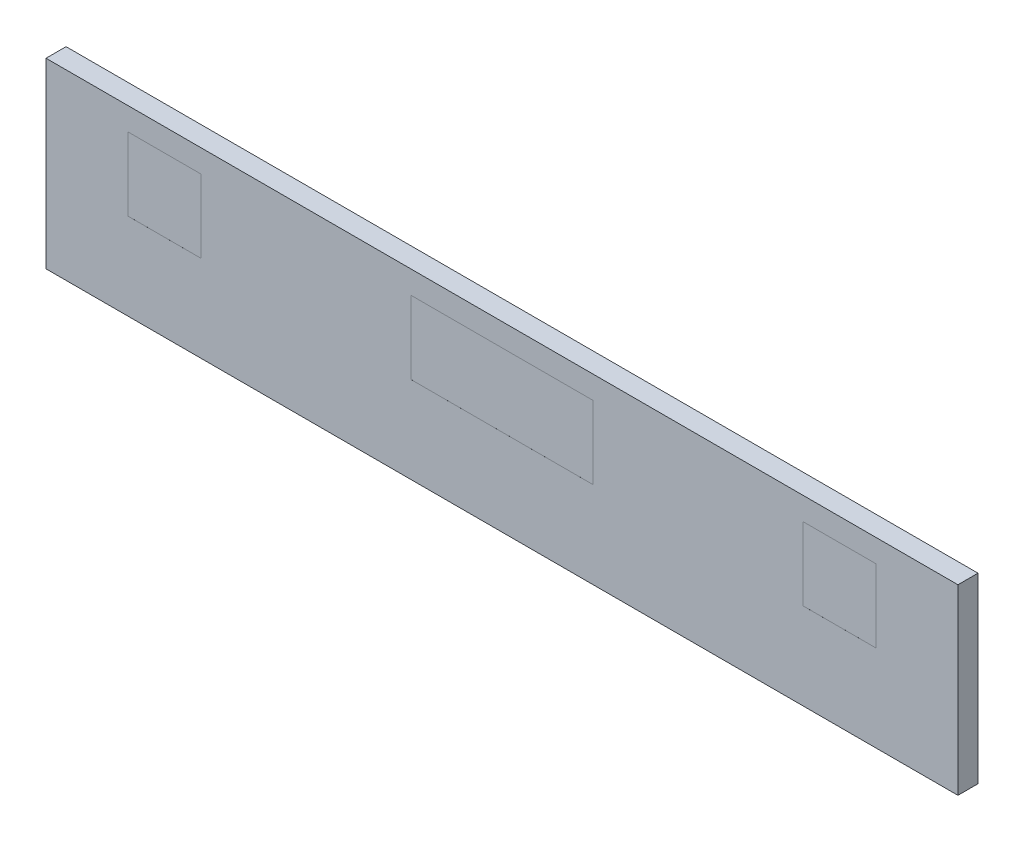
ISO-10303-21;
HEADER;
FILE_DESCRIPTION(('STEP AP214'),'2;1');
FILE_NAME('part.step','',(''),(''),'','','');
FILE_SCHEMA(('AUTOMOTIVE_DESIGN { 1 0 10303 214 1 1 1 1 }'));
ENDSEC;
DATA;
#1=APPLICATION_CONTEXT('core data for automotive mechanical design processes');
#2=APPLICATION_PROTOCOL_DEFINITION('international standard','automotive_design',2000,#1);
#3=PRODUCT_CONTEXT('',#1,'mechanical');
#4=PRODUCT('Part','Part','',(#3));
#5=PRODUCT_RELATED_PRODUCT_CATEGORY('part','',(#4));
#6=PRODUCT_DEFINITION_FORMATION('','',#4);
#7=PRODUCT_DEFINITION_CONTEXT('part definition',#1,'design');
#8=PRODUCT_DEFINITION('design','',#6,#7);
#9=PRODUCT_DEFINITION_SHAPE('','',#8);
#10=(LENGTH_UNIT() NAMED_UNIT(*) SI_UNIT(.MILLI.,.METRE.));
#11=(NAMED_UNIT(*) PLANE_ANGLE_UNIT() SI_UNIT($,.RADIAN.));
#12=(NAMED_UNIT(*) SI_UNIT($,.STERADIAN.) SOLID_ANGLE_UNIT());
#13=UNCERTAINTY_MEASURE_WITH_UNIT(LENGTH_MEASURE(1.E-05),#10,'distance_accuracy_value','');
#14=(GEOMETRIC_REPRESENTATION_CONTEXT(3) GLOBAL_UNCERTAINTY_ASSIGNED_CONTEXT((#13)) GLOBAL_UNIT_ASSIGNED_CONTEXT((#10,
#11,#12)) REPRESENTATION_CONTEXT('',''));
#15=CARTESIAN_POINT('',(0.,0.,0.));
#16=DIRECTION('',(0.,0.,1.));
#17=DIRECTION('',(1.,0.,0.));
#18=AXIS2_PLACEMENT_3D('',#15,#16,#17);
#19=CARTESIAN_POINT('',(370.,135.,21.99));
#20=DIRECTION('',(0.,0.,-1.));
#21=DIRECTION('',(-1.,0.,0.));
#22=AXIS2_PLACEMENT_3D('',#19,#20,#21);
#23=PLANE('',#22);
#24=DIRECTION('',(0.,1.,0.));
#25=VECTOR('',#24,1.);
#26=CARTESIAN_POINT('',(410.,175.,21.99));
#27=LINE('',#26,#25);
#28=CARTESIAN_POINT('',(410.,95.,21.99));
#29=VERTEX_POINT('',#28);
#30=CARTESIAN_POINT('',(410.,175.,21.99));
#31=VERTEX_POINT('',#30);
#32=EDGE_CURVE('E20',#29,#31,#27,.T.);
#33=ORIENTED_EDGE('',*,*,#32,.T.);
#34=DIRECTION('',(-1.,0.,0.));
#35=VECTOR('',#34,1.);
#36=CARTESIAN_POINT('',(330.,175.,21.99));
#37=LINE('',#36,#35);
#38=CARTESIAN_POINT('',(330.,175.,21.99));
#39=VERTEX_POINT('',#38);
#40=EDGE_CURVE('E151',#31,#39,#37,.T.);
#41=ORIENTED_EDGE('',*,*,#40,.T.);
#42=DIRECTION('',(0.,1.,0.));
#43=VECTOR('',#42,1.);
#44=CARTESIAN_POINT('',(330.,95.0000000000001,21.99));
#45=LINE('',#44,#43);
#46=CARTESIAN_POINT('',(330.,95.,21.99));
#47=VERTEX_POINT('',#46);
#48=EDGE_CURVE('E143',#39,#47,#45,.F.);
#49=ORIENTED_EDGE('',*,*,#48,.T.);
#50=DIRECTION('',(1.,0.,0.));
#51=VECTOR('',#50,1.);
#52=CARTESIAN_POINT('',(410.,95.,21.99));
#53=LINE('',#52,#51);
#54=EDGE_CURVE('E127',#47,#29,#53,.T.);
#55=ORIENTED_EDGE('',*,*,#54,.T.);
#56=EDGE_LOOP('',(#33,#41,#49,#55));
#57=FACE_BOUND('',#56,.T.);
#58=ADVANCED_FACE('F17',(#57),#23,.F.);
#59=CARTESIAN_POINT('',(0.,135.,21.99));
#60=DIRECTION('',(0.,0.,-1.));
#61=DIRECTION('',(-1.,0.,0.));
#62=AXIS2_PLACEMENT_3D('',#59,#60,#61);
#63=PLANE('',#62);
#64=DIRECTION('',(0.,1.,0.));
#65=VECTOR('',#64,1.);
#66=CARTESIAN_POINT('',(100.,175.,21.99));
#67=LINE('',#66,#65);
#68=CARTESIAN_POINT('',(100.,95.,21.99));
#69=VERTEX_POINT('',#68);
#70=CARTESIAN_POINT('',(100.,175.,21.99));
#71=VERTEX_POINT('',#70);
#72=EDGE_CURVE('E156',#69,#71,#67,.T.);
#73=ORIENTED_EDGE('',*,*,#72,.T.);
#74=DIRECTION('',(1.,0.,0.));
#75=VECTOR('',#74,1.);
#76=CARTESIAN_POINT('',(-100.,175.,21.99));
#77=LINE('',#76,#75);
#78=CARTESIAN_POINT('',(-100.,175.,21.99));
#79=VERTEX_POINT('',#78);
#80=EDGE_CURVE('E173',#71,#79,#77,.F.);
#81=ORIENTED_EDGE('',*,*,#80,.T.);
#82=DIRECTION('',(0.,1.,0.));
#83=VECTOR('',#82,1.);
#84=CARTESIAN_POINT('',(-100.,95.,21.99));
#85=LINE('',#84,#83);
#86=CARTESIAN_POINT('',(-100.,95.,21.99));
#87=VERTEX_POINT('',#86);
#88=EDGE_CURVE('E164',#79,#87,#85,.F.);
#89=ORIENTED_EDGE('',*,*,#88,.T.);
#90=DIRECTION('',(1.,0.,0.));
#91=VECTOR('',#90,1.);
#92=CARTESIAN_POINT('',(100.,95.,21.99));
#93=LINE('',#92,#91);
#94=EDGE_CURVE('E158',#87,#69,#93,.T.);
#95=ORIENTED_EDGE('',*,*,#94,.T.);
#96=EDGE_LOOP('',(#73,#81,#89,#95));
#97=FACE_BOUND('',#96,.T.);
#98=ADVANCED_FACE('F333',(#97),#63,.F.);
#99=CARTESIAN_POINT('',(-370.,135.,21.99));
#100=DIRECTION('',(0.,0.,-1.));
#101=DIRECTION('',(-1.,0.,0.));
#102=AXIS2_PLACEMENT_3D('',#99,#100,#101);
#103=PLANE('',#102);
#104=DIRECTION('',(0.,1.,0.));
#105=VECTOR('',#104,1.);
#106=CARTESIAN_POINT('',(-330.,175.,21.99));
#107=LINE('',#106,#105);
#108=CARTESIAN_POINT('',(-330.,95.,21.99));
#109=VERTEX_POINT('',#108);
#110=CARTESIAN_POINT('',(-330.,175.,21.99));
#111=VERTEX_POINT('',#110);
#112=EDGE_CURVE('E179',#109,#111,#107,.T.);
#113=ORIENTED_EDGE('',*,*,#112,.T.);
#114=DIRECTION('',(1.,0.,0.));
#115=VECTOR('',#114,1.);
#116=CARTESIAN_POINT('',(-410.,175.,21.99));
#117=LINE('',#116,#115);
#118=CARTESIAN_POINT('',(-410.,175.,21.99));
#119=VERTEX_POINT('',#118);
#120=EDGE_CURVE('E196',#111,#119,#117,.F.);
#121=ORIENTED_EDGE('',*,*,#120,.T.);
#122=DIRECTION('',(0.,1.,0.));
#123=VECTOR('',#122,1.);
#124=CARTESIAN_POINT('',(-410.,95.,21.99));
#125=LINE('',#124,#123);
#126=CARTESIAN_POINT('',(-410.,95.,21.99));
#127=VERTEX_POINT('',#126);
#128=EDGE_CURVE('E187',#119,#127,#125,.F.);
#129=ORIENTED_EDGE('',*,*,#128,.T.);
#130=DIRECTION('',(1.,0.,0.));
#131=VECTOR('',#130,1.);
#132=CARTESIAN_POINT('',(-330.,95.,21.99));
#133=LINE('',#132,#131);
#134=EDGE_CURVE('E181',#127,#109,#133,.T.);
#135=ORIENTED_EDGE('',*,*,#134,.T.);
#136=EDGE_LOOP('',(#113,#121,#129,#135));
#137=FACE_BOUND('',#136,.T.);
#138=ADVANCED_FACE('F331',(#137),#103,.F.);
#139=CARTESIAN_POINT('',(410.,175.,22.));
#140=DIRECTION('',(1.,0.,0.));
#141=DIRECTION('',(0.,0.,-1.));
#142=AXIS2_PLACEMENT_3D('',#139,#140,#141);
#143=PLANE('',#142);
#144=DIRECTION('',(0.,0.,1.));
#145=VECTOR('',#144,1.);
#146=CARTESIAN_POINT('',(410.,175.,22.));
#147=LINE('',#146,#145);
#148=CARTESIAN_POINT('',(410.,175.,22.));
#149=VERTEX_POINT('',#148);
#150=EDGE_CURVE('E137',#149,#31,#147,.F.);
#151=ORIENTED_EDGE('',*,*,#150,.T.);
#152=ORIENTED_EDGE('',*,*,#32,.F.);
#153=DIRECTION('',(0.,0.,1.));
#154=VECTOR('',#153,1.);
#155=CARTESIAN_POINT('',(410.,95.,22.));
#156=LINE('',#155,#154);
#157=CARTESIAN_POINT('',(410.,95.,22.));
#158=VERTEX_POINT('',#157);
#159=EDGE_CURVE('E135',#29,#158,#156,.T.);
#160=ORIENTED_EDGE('',*,*,#159,.T.);
#161=DIRECTION('',(0.,1.,0.));
#162=VECTOR('',#161,1.);
#163=CARTESIAN_POINT('',(410.,100.,22.));
#164=LINE('',#163,#162);
#165=EDGE_CURVE('E202',#149,#158,#164,.F.);
#166=ORIENTED_EDGE('',*,*,#165,.F.);
#167=EDGE_LOOP('',(#151,#152,#160,#166));
#168=FACE_BOUND('',#167,.T.);
#169=ADVANCED_FACE('F133',(#168),#143,.F.);
#170=CARTESIAN_POINT('',(410.,95.,22.));
#171=DIRECTION('',(0.,-1.,0.));
#172=DIRECTION('',(1.,0.,0.));
#173=AXIS2_PLACEMENT_3D('',#170,#171,#172);
#174=PLANE('',#173);
#175=ORIENTED_EDGE('',*,*,#159,.F.);
#176=ORIENTED_EDGE('',*,*,#54,.F.);
#177=DIRECTION('',(0.,0.,1.));
#178=VECTOR('',#177,1.);
#179=CARTESIAN_POINT('',(330.,95.0000000000001,22.));
#180=LINE('',#179,#178);
#181=CARTESIAN_POINT('',(330.,95.0000000000001,22.));
#182=VERTEX_POINT('',#181);
#183=EDGE_CURVE('E148',#47,#182,#180,.T.);
#184=ORIENTED_EDGE('',*,*,#183,.T.);
#185=DIRECTION('',(1.,0.,0.));
#186=VECTOR('',#185,1.);
#187=CARTESIAN_POINT('',(0.,95.,22.));
#188=LINE('',#187,#186);
#189=EDGE_CURVE('E142',#158,#182,#188,.F.);
#190=ORIENTED_EDGE('',*,*,#189,.F.);
#191=EDGE_LOOP('',(#175,#176,#184,#190));
#192=FACE_BOUND('',#191,.T.);
#193=ADVANCED_FACE('F141',(#192),#174,.F.);
#194=CARTESIAN_POINT('',(330.,95.0000000000001,22.));
#195=DIRECTION('',(-1.,0.,0.));
#196=DIRECTION('',(0.,0.,1.));
#197=AXIS2_PLACEMENT_3D('',#194,#195,#196);
#198=PLANE('',#197);
#199=ORIENTED_EDGE('',*,*,#183,.F.);
#200=ORIENTED_EDGE('',*,*,#48,.F.);
#201=DIRECTION('',(0.,0.,1.));
#202=VECTOR('',#201,1.);
#203=CARTESIAN_POINT('',(330.,175.,22.));
#204=LINE('',#203,#202);
#205=CARTESIAN_POINT('',(330.,175.,22.));
#206=VERTEX_POINT('',#205);
#207=EDGE_CURVE('E153',#39,#206,#204,.T.);
#208=ORIENTED_EDGE('',*,*,#207,.T.);
#209=DIRECTION('',(0.,1.,0.));
#210=VECTOR('',#209,1.);
#211=CARTESIAN_POINT('',(330.,100.,22.));
#212=LINE('',#211,#210);
#213=EDGE_CURVE('E205',#182,#206,#212,.T.);
#214=ORIENTED_EDGE('',*,*,#213,.F.);
#215=EDGE_LOOP('',(#199,#200,#208,#214));
#216=FACE_BOUND('',#215,.T.);
#217=ADVANCED_FACE('F322',(#216),#198,.F.);
#218=CARTESIAN_POINT('',(330.,175.,22.));
#219=DIRECTION('',(0.,1.,0.));
#220=DIRECTION('',(-1.,0.,0.));
#221=AXIS2_PLACEMENT_3D('',#218,#219,#220);
#222=PLANE('',#221);
#223=ORIENTED_EDGE('',*,*,#207,.F.);
#224=ORIENTED_EDGE('',*,*,#40,.F.);
#225=ORIENTED_EDGE('',*,*,#150,.F.);
#226=DIRECTION('',(1.,0.,0.));
#227=VECTOR('',#226,1.);
#228=CARTESIAN_POINT('',(0.,175.,22.));
#229=LINE('',#228,#227);
#230=EDGE_CURVE('E207',#206,#149,#229,.T.);
#231=ORIENTED_EDGE('',*,*,#230,.F.);
#232=EDGE_LOOP('',(#223,#224,#225,#231));
#233=FACE_BOUND('',#232,.T.);
#234=ADVANCED_FACE('F318',(#233),#222,.F.);
#235=CARTESIAN_POINT('',(100.,175.,22.));
#236=DIRECTION('',(1.,0.,0.));
#237=DIRECTION('',(0.,0.,-1.));
#238=AXIS2_PLACEMENT_3D('',#235,#236,#237);
#239=PLANE('',#238);
#240=DIRECTION('',(0.,0.,1.));
#241=VECTOR('',#240,1.);
#242=CARTESIAN_POINT('',(100.,175.,22.));
#243=LINE('',#242,#241);
#244=CARTESIAN_POINT('',(100.,175.,22.));
#245=VERTEX_POINT('',#244);
#246=EDGE_CURVE('E170',#245,#71,#243,.F.);
#247=ORIENTED_EDGE('',*,*,#246,.T.);
#248=ORIENTED_EDGE('',*,*,#72,.F.);
#249=DIRECTION('',(0.,0.,-1.));
#250=VECTOR('',#249,1.);
#251=CARTESIAN_POINT('',(100.,95.,22.));
#252=LINE('',#251,#250);
#253=CARTESIAN_POINT('',(100.,95.,22.));
#254=VERTEX_POINT('',#253);
#255=EDGE_CURVE('E161',#69,#254,#252,.F.);
#256=ORIENTED_EDGE('',*,*,#255,.T.);
#257=DIRECTION('',(0.,1.,0.));
#258=VECTOR('',#257,1.);
#259=CARTESIAN_POINT('',(100.,100.,22.));
#260=LINE('',#259,#258);
#261=EDGE_CURVE('E210',#245,#254,#260,.F.);
#262=ORIENTED_EDGE('',*,*,#261,.F.);
#263=EDGE_LOOP('',(#247,#248,#256,#262));
#264=FACE_BOUND('',#263,.T.);
#265=ADVANCED_FACE('F314',(#264),#239,.F.);
#266=CARTESIAN_POINT('',(100.,95.,22.));
#267=DIRECTION('',(0.,-1.,0.));
#268=DIRECTION('',(0.,0.,-1.));
#269=AXIS2_PLACEMENT_3D('',#266,#267,#268);
#270=PLANE('',#269);
#271=ORIENTED_EDGE('',*,*,#255,.F.);
#272=ORIENTED_EDGE('',*,*,#94,.F.);
#273=DIRECTION('',(0.,0.,1.));
#274=VECTOR('',#273,1.);
#275=CARTESIAN_POINT('',(-100.,95.,22.));
#276=LINE('',#275,#274);
#277=CARTESIAN_POINT('',(-100.,95.,22.));
#278=VERTEX_POINT('',#277);
#279=EDGE_CURVE('E167',#87,#278,#276,.T.);
#280=ORIENTED_EDGE('',*,*,#279,.T.);
#281=DIRECTION('',(1.,0.,0.));
#282=VECTOR('',#281,1.);
#283=CARTESIAN_POINT('',(0.,95.,22.));
#284=LINE('',#283,#282);
#285=EDGE_CURVE('E212',#254,#278,#284,.F.);
#286=ORIENTED_EDGE('',*,*,#285,.F.);
#287=EDGE_LOOP('',(#271,#272,#280,#286));
#288=FACE_BOUND('',#287,.T.);
#289=ADVANCED_FACE('F310',(#288),#270,.F.);
#290=CARTESIAN_POINT('',(-100.,95.,22.));
#291=DIRECTION('',(-1.,0.,0.));
#292=DIRECTION('',(0.,0.,1.));
#293=AXIS2_PLACEMENT_3D('',#290,#291,#292);
#294=PLANE('',#293);
#295=ORIENTED_EDGE('',*,*,#279,.F.);
#296=ORIENTED_EDGE('',*,*,#88,.F.);
#297=DIRECTION('',(0.,0.,1.));
#298=VECTOR('',#297,1.);
#299=CARTESIAN_POINT('',(-100.,175.,22.));
#300=LINE('',#299,#298);
#301=CARTESIAN_POINT('',(-100.,175.,22.));
#302=VERTEX_POINT('',#301);
#303=EDGE_CURVE('E176',#79,#302,#300,.T.);
#304=ORIENTED_EDGE('',*,*,#303,.T.);
#305=DIRECTION('',(0.,1.,0.));
#306=VECTOR('',#305,1.);
#307=CARTESIAN_POINT('',(-100.,100.,22.));
#308=LINE('',#307,#306);
#309=EDGE_CURVE('E214',#278,#302,#308,.T.);
#310=ORIENTED_EDGE('',*,*,#309,.F.);
#311=EDGE_LOOP('',(#295,#296,#304,#310));
#312=FACE_BOUND('',#311,.T.);
#313=ADVANCED_FACE('F306',(#312),#294,.F.);
#314=CARTESIAN_POINT('',(-100.,175.,22.));
#315=DIRECTION('',(0.,1.,0.));
#316=DIRECTION('',(0.,0.,1.));
#317=AXIS2_PLACEMENT_3D('',#314,#315,#316);
#318=PLANE('',#317);
#319=ORIENTED_EDGE('',*,*,#303,.F.);
#320=ORIENTED_EDGE('',*,*,#80,.F.);
#321=ORIENTED_EDGE('',*,*,#246,.F.);
#322=DIRECTION('',(1.,0.,0.));
#323=VECTOR('',#322,1.);
#324=CARTESIAN_POINT('',(0.,175.,22.));
#325=LINE('',#324,#323);
#326=EDGE_CURVE('E216',#302,#245,#325,.T.);
#327=ORIENTED_EDGE('',*,*,#326,.F.);
#328=EDGE_LOOP('',(#319,#320,#321,#327));
#329=FACE_BOUND('',#328,.T.);
#330=ADVANCED_FACE('F302',(#329),#318,.F.);
#331=CARTESIAN_POINT('',(-330.,175.,22.));
#332=DIRECTION('',(1.,0.,0.));
#333=DIRECTION('',(0.,0.,-1.));
#334=AXIS2_PLACEMENT_3D('',#331,#332,#333);
#335=PLANE('',#334);
#336=DIRECTION('',(0.,0.,1.));
#337=VECTOR('',#336,1.);
#338=CARTESIAN_POINT('',(-330.,175.,22.));
#339=LINE('',#338,#337);
#340=CARTESIAN_POINT('',(-330.,175.,22.));
#341=VERTEX_POINT('',#340);
#342=EDGE_CURVE('E193',#341,#111,#339,.F.);
#343=ORIENTED_EDGE('',*,*,#342,.T.);
#344=ORIENTED_EDGE('',*,*,#112,.F.);
#345=DIRECTION('',(0.,0.,-1.));
#346=VECTOR('',#345,1.);
#347=CARTESIAN_POINT('',(-330.,95.,22.));
#348=LINE('',#347,#346);
#349=CARTESIAN_POINT('',(-330.,95.,22.));
#350=VERTEX_POINT('',#349);
#351=EDGE_CURVE('E184',#109,#350,#348,.F.);
#352=ORIENTED_EDGE('',*,*,#351,.T.);
#353=DIRECTION('',(0.,1.,0.));
#354=VECTOR('',#353,1.);
#355=CARTESIAN_POINT('',(-330.,100.,22.));
#356=LINE('',#355,#354);
#357=EDGE_CURVE('E219',#341,#350,#356,.F.);
#358=ORIENTED_EDGE('',*,*,#357,.F.);
#359=EDGE_LOOP('',(#343,#344,#352,#358));
#360=FACE_BOUND('',#359,.T.);
#361=ADVANCED_FACE('F298',(#360),#335,.F.);
#362=CARTESIAN_POINT('',(-330.,95.,22.));
#363=DIRECTION('',(0.,-1.,0.));
#364=DIRECTION('',(0.,0.,-1.));
#365=AXIS2_PLACEMENT_3D('',#362,#363,#364);
#366=PLANE('',#365);
#367=ORIENTED_EDGE('',*,*,#351,.F.);
#368=ORIENTED_EDGE('',*,*,#134,.F.);
#369=DIRECTION('',(0.,0.,1.));
#370=VECTOR('',#369,1.);
#371=CARTESIAN_POINT('',(-410.,95.,22.));
#372=LINE('',#371,#370);
#373=CARTESIAN_POINT('',(-410.,95.,22.));
#374=VERTEX_POINT('',#373);
#375=EDGE_CURVE('E190',#127,#374,#372,.T.);
#376=ORIENTED_EDGE('',*,*,#375,.T.);
#377=DIRECTION('',(1.,0.,0.));
#378=VECTOR('',#377,1.);
#379=CARTESIAN_POINT('',(0.,95.,22.));
#380=LINE('',#379,#378);
#381=EDGE_CURVE('E221',#350,#374,#380,.F.);
#382=ORIENTED_EDGE('',*,*,#381,.F.);
#383=EDGE_LOOP('',(#367,#368,#376,#382));
#384=FACE_BOUND('',#383,.T.);
#385=ADVANCED_FACE('F294',(#384),#366,.F.);
#386=CARTESIAN_POINT('',(-410.,95.,22.));
#387=DIRECTION('',(-1.,0.,0.));
#388=DIRECTION('',(0.,0.,1.));
#389=AXIS2_PLACEMENT_3D('',#386,#387,#388);
#390=PLANE('',#389);
#391=ORIENTED_EDGE('',*,*,#375,.F.);
#392=ORIENTED_EDGE('',*,*,#128,.F.);
#393=DIRECTION('',(0.,0.,1.));
#394=VECTOR('',#393,1.);
#395=CARTESIAN_POINT('',(-410.,175.,22.));
#396=LINE('',#395,#394);
#397=CARTESIAN_POINT('',(-410.,175.,22.));
#398=VERTEX_POINT('',#397);
#399=EDGE_CURVE('E199',#119,#398,#396,.T.);
#400=ORIENTED_EDGE('',*,*,#399,.T.);
#401=DIRECTION('',(0.,1.,0.));
#402=VECTOR('',#401,1.);
#403=CARTESIAN_POINT('',(-410.,100.,22.));
#404=LINE('',#403,#402);
#405=EDGE_CURVE('E223',#374,#398,#404,.T.);
#406=ORIENTED_EDGE('',*,*,#405,.F.);
#407=EDGE_LOOP('',(#391,#392,#400,#406));
#408=FACE_BOUND('',#407,.T.);
#409=ADVANCED_FACE('F290',(#408),#390,.F.);
#410=CARTESIAN_POINT('',(-410.,175.,22.));
#411=DIRECTION('',(0.,1.,0.));
#412=DIRECTION('',(0.,0.,1.));
#413=AXIS2_PLACEMENT_3D('',#410,#411,#412);
#414=PLANE('',#413);
#415=ORIENTED_EDGE('',*,*,#399,.F.);
#416=ORIENTED_EDGE('',*,*,#120,.F.);
#417=ORIENTED_EDGE('',*,*,#342,.F.);
#418=DIRECTION('',(1.,0.,0.));
#419=VECTOR('',#418,1.);
#420=CARTESIAN_POINT('',(0.,175.,22.));
#421=LINE('',#420,#419);
#422=EDGE_CURVE('E225',#398,#341,#421,.T.);
#423=ORIENTED_EDGE('',*,*,#422,.F.);
#424=EDGE_LOOP('',(#415,#416,#417,#423));
#425=FACE_BOUND('',#424,.T.);
#426=ADVANCED_FACE('F286',(#425),#414,.F.);
#427=CARTESIAN_POINT('',(0.,100.,22.));
#428=DIRECTION('',(0.,0.,1.));
#429=DIRECTION('',(1.,0.,0.));
#430=AXIS2_PLACEMENT_3D('',#427,#428,#429);
#431=PLANE('',#430);
#432=ORIENTED_EDGE('',*,*,#405,.T.);
#433=ORIENTED_EDGE('',*,*,#422,.T.);
#434=ORIENTED_EDGE('',*,*,#357,.T.);
#435=ORIENTED_EDGE('',*,*,#381,.T.);
#436=EDGE_LOOP('',(#432,#433,#434,#435));
#437=FACE_BOUND('',#436,.T.);
#438=DIRECTION('',(0.,1.,0.));
#439=VECTOR('',#438,1.);
#440=CARTESIAN_POINT('',(-500.,200.,22.));
#441=LINE('',#440,#439);
#442=CARTESIAN_POINT('',(-500.,0.,22.));
#443=VERTEX_POINT('',#442);
#444=CARTESIAN_POINT('',(-500.,200.,22.));
#445=VERTEX_POINT('',#444);
#446=EDGE_CURVE('E235',#443,#445,#441,.T.);
#447=ORIENTED_EDGE('',*,*,#446,.F.);
#448=DIRECTION('',(1.,0.,0.));
#449=VECTOR('',#448,1.);
#450=CARTESIAN_POINT('',(-500.,0.,22.));
#451=LINE('',#450,#449);
#452=CARTESIAN_POINT('',(500.,0.,22.));
#453=VERTEX_POINT('',#452);
#454=EDGE_CURVE('E243',#453,#443,#451,.F.);
#455=ORIENTED_EDGE('',*,*,#454,.F.);
#456=DIRECTION('',(0.,1.,0.));
#457=VECTOR('',#456,1.);
#458=CARTESIAN_POINT('',(500.,0.,22.));
#459=LINE('',#458,#457);
#460=CARTESIAN_POINT('',(500.,200.,22.));
#461=VERTEX_POINT('',#460);
#462=EDGE_CURVE('E228',#461,#453,#459,.F.);
#463=ORIENTED_EDGE('',*,*,#462,.F.);
#464=DIRECTION('',(1.,0.,0.));
#465=VECTOR('',#464,1.);
#466=CARTESIAN_POINT('',(500.,200.,22.));
#467=LINE('',#466,#465);
#468=EDGE_CURVE('E231',#445,#461,#467,.T.);
#469=ORIENTED_EDGE('',*,*,#468,.F.);
#470=EDGE_LOOP('',(#447,#455,#463,#469));
#471=FACE_BOUND('',#470,.T.);
#472=ORIENTED_EDGE('',*,*,#309,.T.);
#473=ORIENTED_EDGE('',*,*,#326,.T.);
#474=ORIENTED_EDGE('',*,*,#261,.T.);
#475=ORIENTED_EDGE('',*,*,#285,.T.);
#476=EDGE_LOOP('',(#472,#473,#474,#475));
#477=FACE_BOUND('',#476,.T.);
#478=ORIENTED_EDGE('',*,*,#213,.T.);
#479=ORIENTED_EDGE('',*,*,#230,.T.);
#480=ORIENTED_EDGE('',*,*,#165,.T.);
#481=ORIENTED_EDGE('',*,*,#189,.T.);
#482=EDGE_LOOP('',(#478,#479,#480,#481));
#483=FACE_BOUND('',#482,.T.);
#484=ADVANCED_FACE('F283',(#437,#471,#477,#483),#431,.T.);
#485=CARTESIAN_POINT('',(500.,0.,0.));
#486=DIRECTION('',(1.,0.,0.));
#487=DIRECTION('',(0.,0.,-1.));
#488=AXIS2_PLACEMENT_3D('',#485,#486,#487);
#489=PLANE('',#488);
#490=ORIENTED_EDGE('',*,*,#462,.T.);
#491=DIRECTION('',(0.,0.,-1.));
#492=VECTOR('',#491,1.);
#493=CARTESIAN_POINT('',(500.,0.,0.));
#494=LINE('',#493,#492);
#495=CARTESIAN_POINT('',(500.,0.,0.));
#496=VERTEX_POINT('',#495);
#497=EDGE_CURVE('E240',#496,#453,#494,.F.);
#498=ORIENTED_EDGE('',*,*,#497,.F.);
#499=DIRECTION('',(0.,1.,0.));
#500=VECTOR('',#499,1.);
#501=CARTESIAN_POINT('',(500.,100.,0.));
#502=LINE('',#501,#500);
#503=CARTESIAN_POINT('',(500.,200.,0.));
#504=VERTEX_POINT('',#503);
#505=EDGE_CURVE('E246',#496,#504,#502,.T.);
#506=ORIENTED_EDGE('',*,*,#505,.T.);
#507=DIRECTION('',(0.,0.,1.));
#508=VECTOR('',#507,1.);
#509=CARTESIAN_POINT('',(500.,200.,0.));
#510=LINE('',#509,#508);
#511=EDGE_CURVE('E233',#461,#504,#510,.F.);
#512=ORIENTED_EDGE('',*,*,#511,.F.);
#513=EDGE_LOOP('',(#490,#498,#506,#512));
#514=FACE_BOUND('',#513,.T.);
#515=ADVANCED_FACE('F265',(#514),#489,.T.);
#516=CARTESIAN_POINT('',(500.,200.,0.));
#517=DIRECTION('',(0.,1.,0.));
#518=DIRECTION('',(0.,0.,1.));
#519=AXIS2_PLACEMENT_3D('',#516,#517,#518);
#520=PLANE('',#519);
#521=ORIENTED_EDGE('',*,*,#468,.T.);
#522=ORIENTED_EDGE('',*,*,#511,.T.);
#523=DIRECTION('',(1.,0.,0.));
#524=VECTOR('',#523,1.);
#525=CARTESIAN_POINT('',(0.,200.,0.));
#526=LINE('',#525,#524);
#527=CARTESIAN_POINT('',(-500.,200.,0.));
#528=VERTEX_POINT('',#527);
#529=EDGE_CURVE('E249',#504,#528,#526,.F.);
#530=ORIENTED_EDGE('',*,*,#529,.T.);
#531=DIRECTION('',(0.,0.,1.));
#532=VECTOR('',#531,1.);
#533=CARTESIAN_POINT('',(-500.,200.,0.));
#534=LINE('',#533,#532);
#535=EDGE_CURVE('E238',#445,#528,#534,.F.);
#536=ORIENTED_EDGE('',*,*,#535,.F.);
#537=EDGE_LOOP('',(#521,#522,#530,#536));
#538=FACE_BOUND('',#537,.T.);
#539=ADVANCED_FACE('F261',(#538),#520,.T.);
#540=CARTESIAN_POINT('',(-500.,200.,0.));
#541=DIRECTION('',(-1.,0.,0.));
#542=DIRECTION('',(0.,0.,1.));
#543=AXIS2_PLACEMENT_3D('',#540,#541,#542);
#544=PLANE('',#543);
#545=ORIENTED_EDGE('',*,*,#446,.T.);
#546=ORIENTED_EDGE('',*,*,#535,.T.);
#547=DIRECTION('',(0.,1.,0.));
#548=VECTOR('',#547,1.);
#549=CARTESIAN_POINT('',(-500.,100.,0.));
#550=LINE('',#549,#548);
#551=CARTESIAN_POINT('',(-500.,0.,0.));
#552=VERTEX_POINT('',#551);
#553=EDGE_CURVE('E26',#528,#552,#550,.F.);
#554=ORIENTED_EDGE('',*,*,#553,.T.);
#555=DIRECTION('',(0.,0.,-1.));
#556=VECTOR('',#555,1.);
#557=CARTESIAN_POINT('',(-500.,0.,0.));
#558=LINE('',#557,#556);
#559=EDGE_CURVE('E34',#443,#552,#558,.T.);
#560=ORIENTED_EDGE('',*,*,#559,.F.);
#561=EDGE_LOOP('',(#545,#546,#554,#560));
#562=FACE_BOUND('',#561,.T.);
#563=ADVANCED_FACE('F255',(#562),#544,.T.);
#564=CARTESIAN_POINT('',(-500.,0.,0.));
#565=DIRECTION('',(0.,-1.,0.));
#566=DIRECTION('',(0.,0.,-1.));
#567=AXIS2_PLACEMENT_3D('',#564,#565,#566);
#568=PLANE('',#567);
#569=ORIENTED_EDGE('',*,*,#454,.T.);
#570=ORIENTED_EDGE('',*,*,#559,.T.);
#571=DIRECTION('',(1.,0.,0.));
#572=VECTOR('',#571,1.);
#573=CARTESIAN_POINT('',(0.,0.,0.));
#574=LINE('',#573,#572);
#575=EDGE_CURVE('E11',#552,#496,#574,.T.);
#576=ORIENTED_EDGE('',*,*,#575,.T.);
#577=ORIENTED_EDGE('',*,*,#497,.T.);
#578=EDGE_LOOP('',(#569,#570,#576,#577));
#579=FACE_BOUND('',#578,.T.);
#580=ADVANCED_FACE('F267',(#579),#568,.T.);
#581=CARTESIAN_POINT('',(0.,100.,0.));
#582=DIRECTION('',(0.,0.,1.));
#583=DIRECTION('',(1.,0.,0.));
#584=AXIS2_PLACEMENT_3D('',#581,#582,#583);
#585=PLANE('',#584);
#586=ORIENTED_EDGE('',*,*,#553,.F.);
#587=ORIENTED_EDGE('',*,*,#529,.F.);
#588=ORIENTED_EDGE('',*,*,#505,.F.);
#589=ORIENTED_EDGE('',*,*,#575,.F.);
#590=EDGE_LOOP('',(#586,#587,#588,#589));
#591=FACE_BOUND('',#590,.T.);
#592=ADVANCED_FACE('F259',(#591),#585,.F.);
#593=CLOSED_SHELL('',(#58,#98,#138,#169,#193,#217,#234,#265,#289,#313,#330,#361,#385,#409,#426,
#484,#515,#539,#563,#580,#592));
#594=MANIFOLD_SOLID_BREP('B1',#593);
#595=ADVANCED_BREP_SHAPE_REPRESENTATION('',(#18,#594),#14);
#596=SHAPE_DEFINITION_REPRESENTATION(#9,#595);
ENDSEC;
END-ISO-10303-21;
